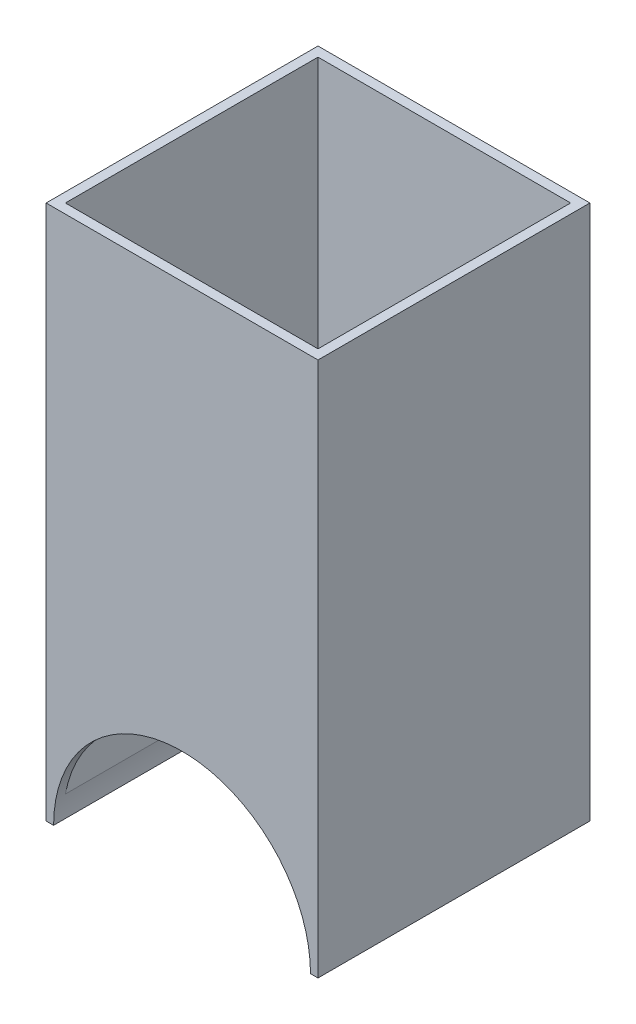
ISO-10303-21;
HEADER;
FILE_DESCRIPTION(('STEP AP214'),'2;1');
FILE_NAME('part.step','',(''),(''),'','','');
FILE_SCHEMA(('AUTOMOTIVE_DESIGN { 1 0 10303 214 1 1 1 1 }'));
ENDSEC;
DATA;
#1=APPLICATION_CONTEXT('core data for automotive mechanical design processes');
#2=APPLICATION_PROTOCOL_DEFINITION('international standard','automotive_design',2000,#1);
#3=PRODUCT_CONTEXT('',#1,'mechanical');
#4=PRODUCT('Part','Part','',(#3));
#5=PRODUCT_RELATED_PRODUCT_CATEGORY('part','',(#4));
#6=PRODUCT_DEFINITION_FORMATION('','',#4);
#7=PRODUCT_DEFINITION_CONTEXT('part definition',#1,'design');
#8=PRODUCT_DEFINITION('design','',#6,#7);
#9=PRODUCT_DEFINITION_SHAPE('','',#8);
#10=(LENGTH_UNIT() NAMED_UNIT(*) SI_UNIT(.MILLI.,.METRE.));
#11=(NAMED_UNIT(*) PLANE_ANGLE_UNIT() SI_UNIT($,.RADIAN.));
#12=(NAMED_UNIT(*) SI_UNIT($,.STERADIAN.) SOLID_ANGLE_UNIT());
#13=UNCERTAINTY_MEASURE_WITH_UNIT(LENGTH_MEASURE(1.E-05),#10,'distance_accuracy_value','');
#14=(GEOMETRIC_REPRESENTATION_CONTEXT(3) GLOBAL_UNCERTAINTY_ASSIGNED_CONTEXT((#13)) GLOBAL_UNIT_ASSIGNED_CONTEXT((#10,
#11,#12)) REPRESENTATION_CONTEXT('',''));
#15=CARTESIAN_POINT('',(0.,0.,0.));
#16=DIRECTION('',(0.,0.,1.));
#17=DIRECTION('',(1.,0.,0.));
#18=AXIS2_PLACEMENT_3D('',#15,#16,#17);
#19=CARTESIAN_POINT('',(0.,0.,0.));
#20=DIRECTION('',(0.,1.,0.));
#21=DIRECTION('',(0.,0.,1.));
#22=AXIS2_PLACEMENT_3D('',#19,#20,#21);
#23=PLANE('',#22);
#24=DIRECTION('',(-1.,0.,0.));
#25=VECTOR('',#24,1.);
#26=CARTESIAN_POINT('',(-12.7,0.,-12.7));
#27=LINE('',#26,#25);
#28=CARTESIAN_POINT('',(-12.,0.,-12.7));
#29=VERTEX_POINT('',#28);
#30=CARTESIAN_POINT('',(-12.7,0.,-12.7));
#31=VERTEX_POINT('',#30);
#32=EDGE_CURVE('E133',#29,#31,#27,.T.);
#33=ORIENTED_EDGE('',*,*,#32,.F.);
#34=DIRECTION('',(0.,0.,1.));
#35=VECTOR('',#34,1.);
#36=CARTESIAN_POINT('',(-12.,0.,-12.7));
#37=LINE('',#36,#35);
#38=CARTESIAN_POINT('',(-12.,0.,12.7));
#39=VERTEX_POINT('',#38);
#40=EDGE_CURVE('E118',#29,#39,#37,.T.);
#41=ORIENTED_EDGE('',*,*,#40,.T.);
#42=DIRECTION('',(1.,0.,0.));
#43=VECTOR('',#42,1.);
#44=CARTESIAN_POINT('',(-12.7,0.,12.7));
#45=LINE('',#44,#43);
#46=CARTESIAN_POINT('',(-12.7,0.,12.7));
#47=VERTEX_POINT('',#46);
#48=EDGE_CURVE('E154',#47,#39,#45,.T.);
#49=ORIENTED_EDGE('',*,*,#48,.F.);
#50=DIRECTION('',(0.,0.,1.));
#51=VECTOR('',#50,1.);
#52=CARTESIAN_POINT('',(-12.7,0.,-12.7));
#53=LINE('',#52,#51);
#54=EDGE_CURVE('E140',#31,#47,#53,.T.);
#55=ORIENTED_EDGE('',*,*,#54,.F.);
#56=EDGE_LOOP('',(#33,#41,#49,#55));
#57=FACE_BOUND('',#56,.T.);
#58=ADVANCED_FACE('F43',(#57),#23,.F.);
#59=CARTESIAN_POINT('',(0.,50.,0.));
#60=DIRECTION('',(0.,1.,0.));
#61=DIRECTION('',(0.,0.,1.));
#62=AXIS2_PLACEMENT_3D('',#59,#60,#61);
#63=PLANE('',#62);
#64=DIRECTION('',(0.,0.,-1.));
#65=VECTOR('',#64,1.);
#66=CARTESIAN_POINT('',(12.7,50.,-12.7));
#67=LINE('',#66,#65);
#68=CARTESIAN_POINT('',(12.7,50.,12.7));
#69=VERTEX_POINT('',#68);
#70=CARTESIAN_POINT('',(12.7,50.,-12.7));
#71=VERTEX_POINT('',#70);
#72=EDGE_CURVE('E157',#69,#71,#67,.T.);
#73=ORIENTED_EDGE('',*,*,#72,.T.);
#74=DIRECTION('',(-1.,0.,0.));
#75=VECTOR('',#74,1.);
#76=CARTESIAN_POINT('',(-12.7,50.,-12.7));
#77=LINE('',#76,#75);
#78=CARTESIAN_POINT('',(-12.7,50.,-12.7));
#79=VERTEX_POINT('',#78);
#80=EDGE_CURVE('E171',#71,#79,#77,.T.);
#81=ORIENTED_EDGE('',*,*,#80,.T.);
#82=DIRECTION('',(0.,0.,1.));
#83=VECTOR('',#82,1.);
#84=CARTESIAN_POINT('',(-12.7,50.,-12.7));
#85=LINE('',#84,#83);
#86=CARTESIAN_POINT('',(-12.7,50.,12.7));
#87=VERTEX_POINT('',#86);
#88=EDGE_CURVE('E224',#79,#87,#85,.T.);
#89=ORIENTED_EDGE('',*,*,#88,.T.);
#90=DIRECTION('',(1.,0.,0.));
#91=VECTOR('',#90,1.);
#92=CARTESIAN_POINT('',(-12.7,50.,12.7));
#93=LINE('',#92,#91);
#94=EDGE_CURVE('E163',#87,#69,#93,.T.);
#95=ORIENTED_EDGE('',*,*,#94,.T.);
#96=EDGE_LOOP('',(#73,#81,#89,#95));
#97=FACE_BOUND('',#96,.T.);
#98=DIRECTION('',(0.,0.,1.));
#99=VECTOR('',#98,1.);
#100=CARTESIAN_POINT('',(-11.8,50.,-11.8));
#101=LINE('',#100,#99);
#102=CARTESIAN_POINT('',(-11.8,50.,-11.8));
#103=VERTEX_POINT('',#102);
#104=CARTESIAN_POINT('',(-11.8,50.,11.8));
#105=VERTEX_POINT('',#104);
#106=EDGE_CURVE('E195',#103,#105,#101,.T.);
#107=ORIENTED_EDGE('',*,*,#106,.F.);
#108=DIRECTION('',(-1.,0.,0.));
#109=VECTOR('',#108,1.);
#110=CARTESIAN_POINT('',(-11.8,50.,-11.8));
#111=LINE('',#110,#109);
#112=CARTESIAN_POINT('',(11.8,50.,-11.8));
#113=VERTEX_POINT('',#112);
#114=EDGE_CURVE('E192',#113,#103,#111,.T.);
#115=ORIENTED_EDGE('',*,*,#114,.F.);
#116=DIRECTION('',(0.,0.,-1.));
#117=VECTOR('',#116,1.);
#118=CARTESIAN_POINT('',(11.8,50.,-11.8));
#119=LINE('',#118,#117);
#120=CARTESIAN_POINT('',(11.8,50.,11.8));
#121=VERTEX_POINT('',#120);
#122=EDGE_CURVE('E202',#121,#113,#119,.T.);
#123=ORIENTED_EDGE('',*,*,#122,.F.);
#124=DIRECTION('',(1.,0.,0.));
#125=VECTOR('',#124,1.);
#126=CARTESIAN_POINT('',(-11.8,50.,11.8));
#127=LINE('',#126,#125);
#128=EDGE_CURVE('E198',#105,#121,#127,.T.);
#129=ORIENTED_EDGE('',*,*,#128,.F.);
#130=EDGE_LOOP('',(#107,#115,#123,#129));
#131=FACE_BOUND('',#130,.T.);
#132=ADVANCED_FACE('F229',(#97,#131),#63,.T.);
#133=CARTESIAN_POINT('',(12.,0.,12.7));
#134=VERTEX_POINT('',#133);
#135=CARTESIAN_POINT('',(12.7,0.,12.7));
#136=VERTEX_POINT('',#135);
#137=EDGE_CURVE('E153',#134,#136,#45,.T.);
#138=ORIENTED_EDGE('',*,*,#137,.F.);
#139=DIRECTION('',(0.,0.,1.));
#140=VECTOR('',#139,1.);
#141=CARTESIAN_POINT('',(12.,0.,-12.7));
#142=LINE('',#141,#140);
#143=CARTESIAN_POINT('',(12.,0.,-12.7));
#144=VERTEX_POINT('',#143);
#145=EDGE_CURVE('E59',#144,#134,#142,.T.);
#146=ORIENTED_EDGE('',*,*,#145,.F.);
#147=CARTESIAN_POINT('',(12.7,0.,-12.7));
#148=VERTEX_POINT('',#147);
#149=EDGE_CURVE('E136',#148,#144,#27,.T.);
#150=ORIENTED_EDGE('',*,*,#149,.F.);
#151=DIRECTION('',(0.,0.,-1.));
#152=VECTOR('',#151,1.);
#153=CARTESIAN_POINT('',(12.7,0.,-12.7));
#154=LINE('',#153,#152);
#155=EDGE_CURVE('E142',#136,#148,#154,.T.);
#156=ORIENTED_EDGE('',*,*,#155,.F.);
#157=EDGE_LOOP('',(#138,#146,#150,#156));
#158=FACE_BOUND('',#157,.T.);
#159=ADVANCED_FACE('F179',(#158),#23,.F.);
#160=CARTESIAN_POINT('',(12.7,50.,-12.7));
#161=DIRECTION('',(-1.,0.,0.));
#162=DIRECTION('',(0.,0.,1.));
#163=AXIS2_PLACEMENT_3D('',#160,#161,#162);
#164=PLANE('',#163);
#165=ORIENTED_EDGE('',*,*,#155,.T.);
#166=DIRECTION('',(0.,-1.,0.));
#167=VECTOR('',#166,1.);
#168=CARTESIAN_POINT('',(12.7,50.,-12.7));
#169=LINE('',#168,#167);
#170=EDGE_CURVE('E52',#71,#148,#169,.T.);
#171=ORIENTED_EDGE('',*,*,#170,.F.);
#172=ORIENTED_EDGE('',*,*,#72,.F.);
#173=DIRECTION('',(0.,-1.,0.));
#174=VECTOR('',#173,1.);
#175=CARTESIAN_POINT('',(12.7,50.,12.7));
#176=LINE('',#175,#174);
#177=EDGE_CURVE('E158',#69,#136,#176,.T.);
#178=ORIENTED_EDGE('',*,*,#177,.T.);
#179=EDGE_LOOP('',(#165,#171,#172,#178));
#180=FACE_BOUND('',#179,.T.);
#181=ADVANCED_FACE('F45',(#180),#164,.F.);
#182=CARTESIAN_POINT('',(-12.7,50.,-12.7));
#183=DIRECTION('',(0.,0.,1.));
#184=DIRECTION('',(1.,0.,0.));
#185=AXIS2_PLACEMENT_3D('',#182,#183,#184);
#186=PLANE('',#185);
#187=ORIENTED_EDGE('',*,*,#149,.T.);
#188=CARTESIAN_POINT('',(0.,0.,-12.7));
#189=DIRECTION('',(0.,0.,1.));
#190=DIRECTION('',(1.,0.,0.));
#191=AXIS2_PLACEMENT_3D('',#188,#189,#190);
#192=CIRCLE('',#191,12.);
#193=EDGE_CURVE('E121',#144,#29,#192,.T.);
#194=ORIENTED_EDGE('',*,*,#193,.T.);
#195=ORIENTED_EDGE('',*,*,#32,.T.);
#196=DIRECTION('',(0.,-1.,0.));
#197=VECTOR('',#196,1.);
#198=CARTESIAN_POINT('',(-12.7,50.,-12.7));
#199=LINE('',#198,#197);
#200=EDGE_CURVE('E167',#79,#31,#199,.T.);
#201=ORIENTED_EDGE('',*,*,#200,.F.);
#202=ORIENTED_EDGE('',*,*,#80,.F.);
#203=ORIENTED_EDGE('',*,*,#170,.T.);
#204=EDGE_LOOP('',(#187,#194,#195,#201,#202,#203));
#205=FACE_BOUND('',#204,.T.);
#206=ADVANCED_FACE('F131',(#205),#186,.F.);
#207=CARTESIAN_POINT('',(-12.7,50.,-12.7));
#208=DIRECTION('',(1.,0.,0.));
#209=DIRECTION('',(0.,0.,-1.));
#210=AXIS2_PLACEMENT_3D('',#207,#208,#209);
#211=PLANE('',#210);
#212=ORIENTED_EDGE('',*,*,#54,.T.);
#213=DIRECTION('',(0.,-1.,0.));
#214=VECTOR('',#213,1.);
#215=CARTESIAN_POINT('',(-12.7,50.,12.7));
#216=LINE('',#215,#214);
#217=EDGE_CURVE('E162',#87,#47,#216,.T.);
#218=ORIENTED_EDGE('',*,*,#217,.F.);
#219=ORIENTED_EDGE('',*,*,#88,.F.);
#220=ORIENTED_EDGE('',*,*,#200,.T.);
#221=EDGE_LOOP('',(#212,#218,#219,#220));
#222=FACE_BOUND('',#221,.T.);
#223=ADVANCED_FACE('F238',(#222),#211,.F.);
#224=CARTESIAN_POINT('',(-12.7,50.,12.7));
#225=DIRECTION('',(0.,0.,-1.));
#226=DIRECTION('',(-1.,0.,0.));
#227=AXIS2_PLACEMENT_3D('',#224,#225,#226);
#228=PLANE('',#227);
#229=ORIENTED_EDGE('',*,*,#48,.T.);
#230=CARTESIAN_POINT('',(0.,0.,12.7));
#231=DIRECTION('',(0.,0.,1.));
#232=DIRECTION('',(1.,0.,0.));
#233=AXIS2_PLACEMENT_3D('',#230,#231,#232);
#234=CIRCLE('',#233,12.);
#235=EDGE_CURVE('E122',#134,#39,#234,.T.);
#236=ORIENTED_EDGE('',*,*,#235,.F.);
#237=ORIENTED_EDGE('',*,*,#137,.T.);
#238=ORIENTED_EDGE('',*,*,#177,.F.);
#239=ORIENTED_EDGE('',*,*,#94,.F.);
#240=ORIENTED_EDGE('',*,*,#217,.T.);
#241=EDGE_LOOP('',(#229,#236,#237,#238,#239,#240));
#242=FACE_BOUND('',#241,.T.);
#243=ADVANCED_FACE('F234',(#242),#228,.F.);
#244=CARTESIAN_POINT('',(-11.8,50.,-11.8));
#245=DIRECTION('',(0.,0.,1.));
#246=DIRECTION('',(1.,0.,0.));
#247=AXIS2_PLACEMENT_3D('',#244,#245,#246);
#248=PLANE('',#247);
#249=CARTESIAN_POINT('',(0.,0.,-11.8));
#250=DIRECTION('',(0.,0.,1.));
#251=DIRECTION('',(1.,0.,0.));
#252=AXIS2_PLACEMENT_3D('',#249,#250,#251);
#253=CIRCLE('',#252,12.);
#254=CARTESIAN_POINT('',(11.8,2.18174242292717,-11.8));
#255=VERTEX_POINT('',#254);
#256=CARTESIAN_POINT('',(-11.8,2.18174242292716,-11.8));
#257=VERTEX_POINT('',#256);
#258=EDGE_CURVE('E189',#255,#257,#253,.T.);
#259=ORIENTED_EDGE('',*,*,#258,.F.);
#260=DIRECTION('',(0.,-1.,0.));
#261=VECTOR('',#260,1.);
#262=CARTESIAN_POINT('',(11.8,50.,-11.8));
#263=LINE('',#262,#261);
#264=EDGE_CURVE('E205',#113,#255,#263,.T.);
#265=ORIENTED_EDGE('',*,*,#264,.F.);
#266=ORIENTED_EDGE('',*,*,#114,.T.);
#267=DIRECTION('',(0.,-1.,0.));
#268=VECTOR('',#267,1.);
#269=CARTESIAN_POINT('',(-11.8,50.,-11.8));
#270=LINE('',#269,#268);
#271=EDGE_CURVE('E147',#103,#257,#270,.T.);
#272=ORIENTED_EDGE('',*,*,#271,.T.);
#273=EDGE_LOOP('',(#259,#265,#266,#272));
#274=FACE_BOUND('',#273,.T.);
#275=ADVANCED_FACE('F245',(#274),#248,.T.);
#276=CARTESIAN_POINT('',(-11.8,50.,-11.8));
#277=DIRECTION('',(1.,0.,0.));
#278=DIRECTION('',(0.,0.,-1.));
#279=AXIS2_PLACEMENT_3D('',#276,#277,#278);
#280=PLANE('',#279);
#281=DIRECTION('',(0.,0.,1.));
#282=VECTOR('',#281,1.);
#283=CARTESIAN_POINT('',(-11.8,2.18174242292716,-12.7));
#284=LINE('',#283,#282);
#285=CARTESIAN_POINT('',(-11.8,2.18174242292717,11.8));
#286=VERTEX_POINT('',#285);
#287=EDGE_CURVE('E183',#257,#286,#284,.T.);
#288=ORIENTED_EDGE('',*,*,#287,.F.);
#289=ORIENTED_EDGE('',*,*,#271,.F.);
#290=ORIENTED_EDGE('',*,*,#106,.T.);
#291=DIRECTION('',(0.,-1.,0.));
#292=VECTOR('',#291,1.);
#293=CARTESIAN_POINT('',(-11.8,50.,11.8));
#294=LINE('',#293,#292);
#295=EDGE_CURVE('E213',#105,#286,#294,.T.);
#296=ORIENTED_EDGE('',*,*,#295,.T.);
#297=EDGE_LOOP('',(#288,#289,#290,#296));
#298=FACE_BOUND('',#297,.T.);
#299=ADVANCED_FACE('F284',(#298),#280,.T.);
#300=CARTESIAN_POINT('',(-11.8,50.,11.8));
#301=DIRECTION('',(0.,0.,-1.));
#302=DIRECTION('',(-1.,0.,0.));
#303=AXIS2_PLACEMENT_3D('',#300,#301,#302);
#304=PLANE('',#303);
#305=CARTESIAN_POINT('',(0.,0.,11.8));
#306=DIRECTION('',(0.,0.,-1.));
#307=DIRECTION('',(-1.,0.,0.));
#308=AXIS2_PLACEMENT_3D('',#305,#306,#307);
#309=CIRCLE('',#308,12.);
#310=CARTESIAN_POINT('',(11.8,2.18174242292717,11.8));
#311=VERTEX_POINT('',#310);
#312=EDGE_CURVE('E66',#286,#311,#309,.T.);
#313=ORIENTED_EDGE('',*,*,#312,.F.);
#314=ORIENTED_EDGE('',*,*,#295,.F.);
#315=ORIENTED_EDGE('',*,*,#128,.T.);
#316=DIRECTION('',(0.,-1.,0.));
#317=VECTOR('',#316,1.);
#318=CARTESIAN_POINT('',(11.8,50.,11.8));
#319=LINE('',#318,#317);
#320=EDGE_CURVE('E209',#121,#311,#319,.T.);
#321=ORIENTED_EDGE('',*,*,#320,.T.);
#322=EDGE_LOOP('',(#313,#314,#315,#321));
#323=FACE_BOUND('',#322,.T.);
#324=ADVANCED_FACE('F295',(#323),#304,.T.);
#325=CARTESIAN_POINT('',(11.8,50.,-11.8));
#326=DIRECTION('',(-1.,0.,0.));
#327=DIRECTION('',(0.,0.,1.));
#328=AXIS2_PLACEMENT_3D('',#325,#326,#327);
#329=PLANE('',#328);
#330=DIRECTION('',(0.,0.,1.));
#331=VECTOR('',#330,1.);
#332=CARTESIAN_POINT('',(11.8,2.18174242292717,-12.7));
#333=LINE('',#332,#331);
#334=EDGE_CURVE('E11',#311,#255,#333,.F.);
#335=ORIENTED_EDGE('',*,*,#334,.F.);
#336=ORIENTED_EDGE('',*,*,#320,.F.);
#337=ORIENTED_EDGE('',*,*,#122,.T.);
#338=ORIENTED_EDGE('',*,*,#264,.T.);
#339=EDGE_LOOP('',(#335,#336,#337,#338));
#340=FACE_BOUND('',#339,.T.);
#341=ADVANCED_FACE('F306',(#340),#329,.T.);
#342=CARTESIAN_POINT('',(0.,0.,-12.7));
#343=DIRECTION('',(0.,0.,1.));
#344=DIRECTION('',(1.,0.,0.));
#345=AXIS2_PLACEMENT_3D('',#342,#343,#344);
#346=CYLINDRICAL_SURFACE('',#345,12.);
#347=ORIENTED_EDGE('',*,*,#258,.T.);
#348=ORIENTED_EDGE('',*,*,#287,.T.);
#349=ORIENTED_EDGE('',*,*,#312,.T.);
#350=ORIENTED_EDGE('',*,*,#334,.T.);
#351=EDGE_LOOP('',(#347,#348,#349,#350));
#352=FACE_BOUND('',#351,.T.);
#353=ORIENTED_EDGE('',*,*,#235,.T.);
#354=ORIENTED_EDGE('',*,*,#40,.F.);
#355=ORIENTED_EDGE('',*,*,#193,.F.);
#356=ORIENTED_EDGE('',*,*,#145,.T.);
#357=EDGE_LOOP('',(#353,#354,#355,#356));
#358=FACE_BOUND('',#357,.T.);
#359=ADVANCED_FACE('F120',(#352,#358),#346,.F.);
#360=CLOSED_SHELL('',(#58,#132,#159,#181,#206,#223,#243,#275,#299,#324,#341,#359));
#361=MANIFOLD_SOLID_BREP('B2',#360);
#362=ADVANCED_BREP_SHAPE_REPRESENTATION('',(#18,#361),#14);
#363=SHAPE_DEFINITION_REPRESENTATION(#9,#362);
ENDSEC;
END-ISO-10303-21;
